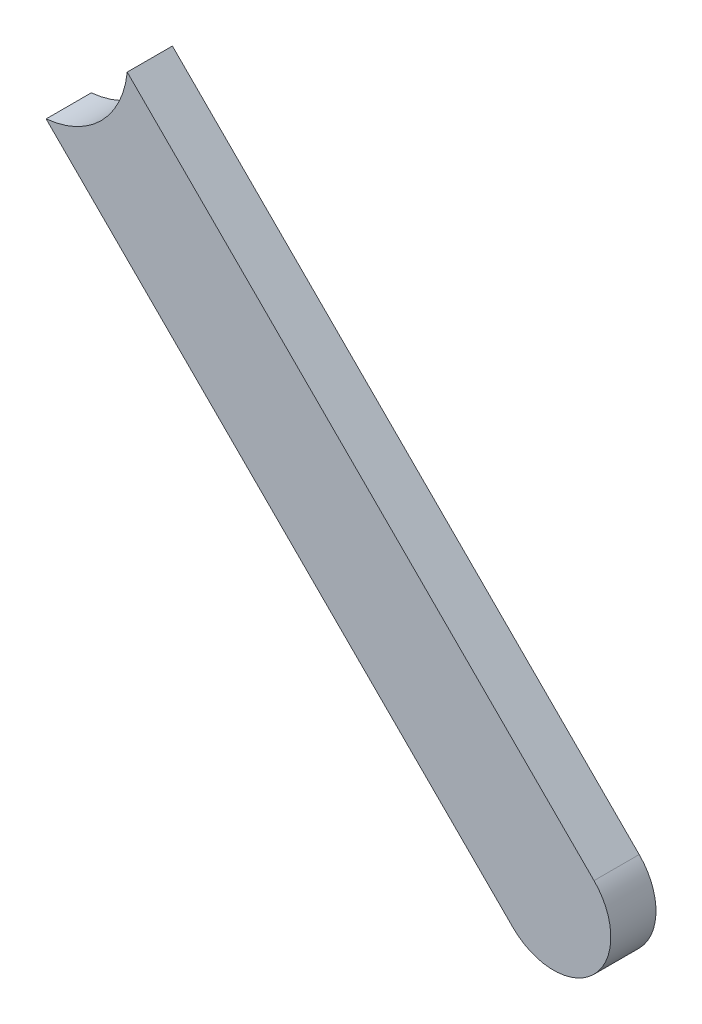
ISO-10303-21;
HEADER;
FILE_DESCRIPTION(('STEP AP214'),'2;1');
FILE_NAME('part.step','',(''),(''),'','','');
FILE_SCHEMA(('AUTOMOTIVE_DESIGN { 1 0 10303 214 1 1 1 1 }'));
ENDSEC;
DATA;
#1=APPLICATION_CONTEXT('core data for automotive mechanical design processes');
#2=APPLICATION_PROTOCOL_DEFINITION('international standard','automotive_design',2000,#1);
#3=PRODUCT_CONTEXT('',#1,'mechanical');
#4=PRODUCT('Part','Part','',(#3));
#5=PRODUCT_RELATED_PRODUCT_CATEGORY('part','',(#4));
#6=PRODUCT_DEFINITION_FORMATION('','',#4);
#7=PRODUCT_DEFINITION_CONTEXT('part definition',#1,'design');
#8=PRODUCT_DEFINITION('design','',#6,#7);
#9=PRODUCT_DEFINITION_SHAPE('','',#8);
#10=(LENGTH_UNIT() NAMED_UNIT(*) SI_UNIT(.MILLI.,.METRE.));
#11=(NAMED_UNIT(*) PLANE_ANGLE_UNIT() SI_UNIT($,.RADIAN.));
#12=(NAMED_UNIT(*) SI_UNIT($,.STERADIAN.) SOLID_ANGLE_UNIT());
#13=UNCERTAINTY_MEASURE_WITH_UNIT(LENGTH_MEASURE(1.E-05),#10,'distance_accuracy_value','');
#14=(GEOMETRIC_REPRESENTATION_CONTEXT(3) GLOBAL_UNCERTAINTY_ASSIGNED_CONTEXT((#13)) GLOBAL_UNIT_ASSIGNED_CONTEXT((#10,
#11,#12)) REPRESENTATION_CONTEXT('',''));
#15=CARTESIAN_POINT('',(0.,0.,0.));
#16=DIRECTION('',(0.,0.,1.));
#17=DIRECTION('',(1.,0.,0.));
#18=AXIS2_PLACEMENT_3D('',#15,#16,#17);
#19=CARTESIAN_POINT('',(112.5608920836,59.7998960364001,0.));
#20=DIRECTION('',(0.707106781186548,0.707106781186548,0.));
#21=DIRECTION('',(0.707106781186548,-0.707106781186548,0.));
#22=AXIS2_PLACEMENT_3D('',#19,#20,#21);
#23=PLANE('',#22);
#24=DIRECTION('',(0.707106781186548,-0.707106781186548,0.));
#25=VECTOR('',#24,1.);
#26=CARTESIAN_POINT('',(112.34239406,60.01839406,0.1999996));
#27=LINE('',#26,#25);
#28=CARTESIAN_POINT('',(112.5608920836,59.7998960364002,0.1999996));
#29=VERTEX_POINT('',#28);
#30=CARTESIAN_POINT('',(114.62839406,57.73239406,0.1999996));
#31=VERTEX_POINT('',#30);
#32=EDGE_CURVE('E11',#29,#31,#27,.T.);
#33=ORIENTED_EDGE('',*,*,#32,.F.);
#34=DIRECTION('',(0.,0.,1.));
#35=VECTOR('',#34,1.);
#36=CARTESIAN_POINT('',(112.5608920836,59.7998960364002,0.));
#37=LINE('',#36,#35);
#38=CARTESIAN_POINT('',(112.5608920836,59.7998960364002,0.));
#39=VERTEX_POINT('',#38);
#40=EDGE_CURVE('E24',#39,#29,#37,.T.);
#41=ORIENTED_EDGE('',*,*,#40,.F.);
#42=DIRECTION('',(0.707106781186548,-0.707106781186548,0.));
#43=VECTOR('',#42,1.);
#44=CARTESIAN_POINT('',(112.34239406,60.01839406,0.));
#45=LINE('',#44,#43);
#46=CARTESIAN_POINT('',(114.62839406,57.73239406,0.));
#47=VERTEX_POINT('',#46);
#48=EDGE_CURVE('E75',#39,#47,#45,.T.);
#49=ORIENTED_EDGE('',*,*,#48,.T.);
#50=DIRECTION('',(0.,0.,1.));
#51=VECTOR('',#50,1.);
#52=CARTESIAN_POINT('',(114.62839406,57.73239406,0.));
#53=LINE('',#52,#51);
#54=EDGE_CURVE('E37',#47,#31,#53,.T.);
#55=ORIENTED_EDGE('',*,*,#54,.T.);
#56=EDGE_LOOP('',(#33,#41,#49,#55));
#57=FACE_BOUND('',#56,.T.);
#58=ADVANCED_FACE('F17',(#57),#23,.F.);
#59=CARTESIAN_POINT('',(114.808,57.912,0.));
#60=DIRECTION('',(0.,0.,-1.));
#61=DIRECTION('',(-0.707106781186548,-0.707106781186548,0.));
#62=AXIS2_PLACEMENT_3D('',#59,#60,#61);
#63=CYLINDRICAL_SURFACE('',#62,0.254001156230771);
#64=CARTESIAN_POINT('',(114.808,57.912,0.1999996));
#65=DIRECTION('',(0.,0.,1.));
#66=DIRECTION('',(-0.707106781186548,-0.707106781186548,0.));
#67=AXIS2_PLACEMENT_3D('',#64,#65,#66);
#68=CIRCLE('',#67,0.254001156230771);
#69=CARTESIAN_POINT('',(114.98760594,58.09160594,0.1999996));
#70=VERTEX_POINT('',#69);
#71=EDGE_CURVE('E83',#31,#70,#68,.T.);
#72=ORIENTED_EDGE('',*,*,#71,.F.);
#73=ORIENTED_EDGE('',*,*,#54,.F.);
#74=CARTESIAN_POINT('',(114.808,57.912,0.));
#75=DIRECTION('',(0.,0.,1.));
#76=DIRECTION('',(-0.707106781186548,-0.707106781186548,0.));
#77=AXIS2_PLACEMENT_3D('',#74,#75,#76);
#78=CIRCLE('',#77,0.254001156230771);
#79=CARTESIAN_POINT('',(114.98760594,58.09160594,0.));
#80=VERTEX_POINT('',#79);
#81=EDGE_CURVE('E81',#47,#80,#78,.T.);
#82=ORIENTED_EDGE('',*,*,#81,.T.);
#83=DIRECTION('',(0.,0.,1.));
#84=VECTOR('',#83,1.);
#85=CARTESIAN_POINT('',(114.98760594,58.09160594,0.));
#86=LINE('',#85,#84);
#87=EDGE_CURVE('E67',#80,#70,#86,.T.);
#88=ORIENTED_EDGE('',*,*,#87,.T.);
#89=EDGE_LOOP('',(#72,#73,#82,#88));
#90=FACE_BOUND('',#89,.T.);
#91=ADVANCED_FACE('F89',(#90),#63,.T.);
#92=CARTESIAN_POINT('',(114.98760594,58.09160594,0.));
#93=DIRECTION('',(-0.707106781186548,-0.707106781186548,0.));
#94=DIRECTION('',(-0.707106781186548,0.707106781186548,0.));
#95=AXIS2_PLACEMENT_3D('',#92,#93,#94);
#96=PLANE('',#95);
#97=DIRECTION('',(-0.707106781186548,0.707106781186548,0.));
#98=VECTOR('',#97,1.);
#99=CARTESIAN_POINT('',(114.98760594,58.09160594,0.1999996));
#100=LINE('',#99,#98);
#101=CARTESIAN_POINT('',(112.9201039636,60.1591079164002,0.1999996));
#102=VERTEX_POINT('',#101);
#103=EDGE_CURVE('E71',#70,#102,#100,.T.);
#104=ORIENTED_EDGE('',*,*,#103,.F.);
#105=ORIENTED_EDGE('',*,*,#87,.F.);
#106=DIRECTION('',(-0.707106781186548,0.707106781186548,0.));
#107=VECTOR('',#106,1.);
#108=CARTESIAN_POINT('',(114.98760594,58.09160594,0.));
#109=LINE('',#108,#107);
#110=CARTESIAN_POINT('',(112.9201039636,60.1591079164002,0.));
#111=VERTEX_POINT('',#110);
#112=EDGE_CURVE('E63',#80,#111,#109,.T.);
#113=ORIENTED_EDGE('',*,*,#112,.T.);
#114=DIRECTION('',(0.,0.,1.));
#115=VECTOR('',#114,1.);
#116=CARTESIAN_POINT('',(112.9201039636,60.1591079164002,0.));
#117=LINE('',#116,#115);
#118=EDGE_CURVE('E53',#111,#102,#117,.T.);
#119=ORIENTED_EDGE('',*,*,#118,.T.);
#120=EDGE_LOOP('',(#104,#105,#113,#119));
#121=FACE_BOUND('',#120,.T.);
#122=ADVANCED_FACE('F66',(#121),#96,.F.);
#123=CARTESIAN_POINT('',(112.522,60.198,0.));
#124=DIRECTION('',(0.,0.,-1.));
#125=DIRECTION('',(1.,0.,0.));
#126=AXIS2_PLACEMENT_3D('',#123,#124,#125);
#127=CYLINDRICAL_SURFACE('',#126,0.3999992);
#128=ORIENTED_EDGE('',*,*,#40,.T.);
#129=CARTESIAN_POINT('',(112.522,60.198,0.1999996));
#130=DIRECTION('',(0.,0.,1.));
#131=DIRECTION('',(1.,0.,0.));
#132=AXIS2_PLACEMENT_3D('',#129,#130,#131);
#133=CIRCLE('',#132,0.3999992);
#134=EDGE_CURVE('E59',#29,#102,#133,.T.);
#135=ORIENTED_EDGE('',*,*,#134,.T.);
#136=ORIENTED_EDGE('',*,*,#118,.F.);
#137=CARTESIAN_POINT('',(112.522,60.198,0.));
#138=DIRECTION('',(0.,0.,1.));
#139=DIRECTION('',(1.,0.,0.));
#140=AXIS2_PLACEMENT_3D('',#137,#138,#139);
#141=CIRCLE('',#140,0.3999992);
#142=EDGE_CURVE('E57',#39,#111,#141,.T.);
#143=ORIENTED_EDGE('',*,*,#142,.F.);
#144=EDGE_LOOP('',(#128,#135,#136,#143));
#145=FACE_BOUND('',#144,.T.);
#146=ADVANCED_FACE('F55',(#145),#127,.F.);
#147=CARTESIAN_POINT('',(112.34239406,60.01839406,0.));
#148=DIRECTION('',(0.,0.,-1.));
#149=DIRECTION('',(-1.,0.,0.));
#150=AXIS2_PLACEMENT_3D('',#147,#148,#149);
#151=PLANE('',#150);
#152=ORIENTED_EDGE('',*,*,#48,.F.);
#153=ORIENTED_EDGE('',*,*,#142,.T.);
#154=ORIENTED_EDGE('',*,*,#112,.F.);
#155=ORIENTED_EDGE('',*,*,#81,.F.);
#156=EDGE_LOOP('',(#152,#153,#154,#155));
#157=FACE_BOUND('',#156,.T.);
#158=ADVANCED_FACE('F74',(#157),#151,.T.);
#159=CARTESIAN_POINT('',(112.34239406,60.01839406,0.1999996));
#160=DIRECTION('',(0.,0.,-1.));
#161=DIRECTION('',(-1.,0.,0.));
#162=AXIS2_PLACEMENT_3D('',#159,#160,#161);
#163=PLANE('',#162);
#164=ORIENTED_EDGE('',*,*,#134,.F.);
#165=ORIENTED_EDGE('',*,*,#32,.T.);
#166=ORIENTED_EDGE('',*,*,#71,.T.);
#167=ORIENTED_EDGE('',*,*,#103,.T.);
#168=EDGE_LOOP('',(#164,#165,#166,#167));
#169=FACE_BOUND('',#168,.T.);
#170=ADVANCED_FACE('F91',(#169),#163,.F.);
#171=CLOSED_SHELL('',(#58,#91,#122,#146,#158,#170));
#172=MANIFOLD_SOLID_BREP('B1',#171);
#173=ADVANCED_BREP_SHAPE_REPRESENTATION('',(#18,#172),#14);
#174=SHAPE_DEFINITION_REPRESENTATION(#9,#173);
ENDSEC;
END-ISO-10303-21;
